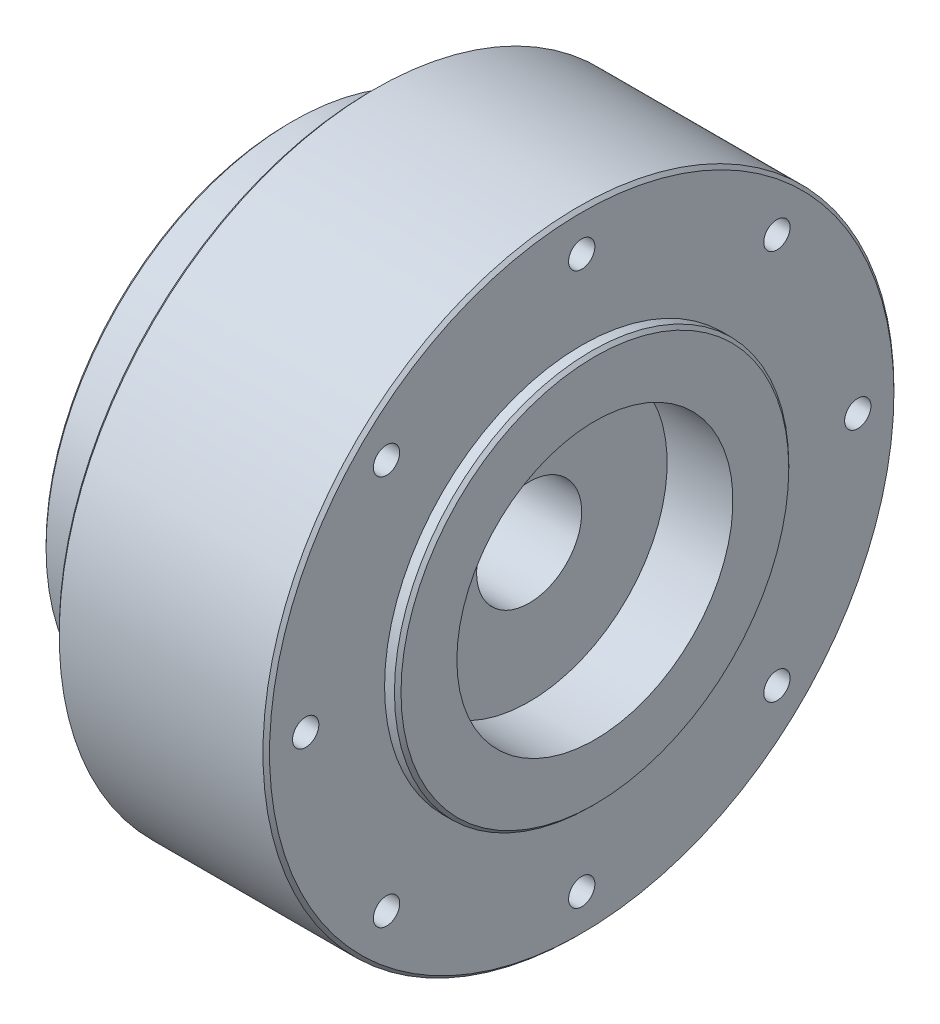
ISO-10303-21;
HEADER;
FILE_DESCRIPTION(('STEP AP214'),'2;1');
FILE_NAME('part.step','',(''),(''),'','','');
FILE_SCHEMA(('AUTOMOTIVE_DESIGN { 1 0 10303 214 1 1 1 1 }'));
ENDSEC;
DATA;
#1=APPLICATION_CONTEXT('core data for automotive mechanical design processes');
#2=APPLICATION_PROTOCOL_DEFINITION('international standard','automotive_design',2000,#1);
#3=PRODUCT_CONTEXT('',#1,'mechanical');
#4=PRODUCT('Part','Part','',(#3));
#5=PRODUCT_RELATED_PRODUCT_CATEGORY('part','',(#4));
#6=PRODUCT_DEFINITION_FORMATION('','',#4);
#7=PRODUCT_DEFINITION_CONTEXT('part definition',#1,'design');
#8=PRODUCT_DEFINITION('design','',#6,#7);
#9=PRODUCT_DEFINITION_SHAPE('','',#8);
#10=(LENGTH_UNIT() NAMED_UNIT(*) SI_UNIT(.MILLI.,.METRE.));
#11=(NAMED_UNIT(*) PLANE_ANGLE_UNIT() SI_UNIT($,.RADIAN.));
#12=(NAMED_UNIT(*) SI_UNIT($,.STERADIAN.) SOLID_ANGLE_UNIT());
#13=UNCERTAINTY_MEASURE_WITH_UNIT(LENGTH_MEASURE(1.E-05),#10,'distance_accuracy_value','');
#14=(GEOMETRIC_REPRESENTATION_CONTEXT(3) GLOBAL_UNCERTAINTY_ASSIGNED_CONTEXT((#13)) GLOBAL_UNIT_ASSIGNED_CONTEXT((#10,
#11,#12)) REPRESENTATION_CONTEXT('',''));
#15=CARTESIAN_POINT('',(0.,0.,0.));
#16=DIRECTION('',(0.,0.,1.));
#17=DIRECTION('',(1.,0.,0.));
#18=AXIS2_PLACEMENT_3D('',#15,#16,#17);
#19=CARTESIAN_POINT('',(-44.5,0.,0.));
#20=DIRECTION('',(-1.,0.,0.));
#21=DIRECTION('',(0.,0.,1.));
#22=AXIS2_PLACEMENT_3D('',#19,#20,#21);
#23=PLANE('',#22);
#24=CARTESIAN_POINT('',(-44.5,0.,0.));
#25=DIRECTION('',(-1.,0.,0.));
#26=DIRECTION('',(0.,0.,1.));
#27=AXIS2_PLACEMENT_3D('',#24,#25,#26);
#28=CIRCLE('',#27,37.);
#29=CARTESIAN_POINT('',(-44.5,0.,37.));
#30=VERTEX_POINT('',#29);
#31=EDGE_CURVE('E88',#30,#30,#28,.T.);
#32=ORIENTED_EDGE('',*,*,#31,.T.);
#33=EDGE_LOOP('',(#32));
#34=FACE_BOUND('',#33,.T.);
#35=ADVANCED_FACE('F47',(#34),#23,.T.);
#36=CARTESIAN_POINT('',(-42.5,0.,0.));
#37=DIRECTION('',(-1.,0.,0.));
#38=DIRECTION('',(0.,0.,1.));
#39=AXIS2_PLACEMENT_3D('',#36,#37,#38);
#40=PLANE('',#39);
#41=CARTESIAN_POINT('',(-42.5,0.,0.));
#42=DIRECTION('',(-1.,0.,0.));
#43=DIRECTION('',(0.,0.,1.));
#44=AXIS2_PLACEMENT_3D('',#41,#42,#43);
#45=CIRCLE('',#44,11.);
#46=CARTESIAN_POINT('',(-42.5,0.,11.));
#47=VERTEX_POINT('',#46);
#48=EDGE_CURVE('E92',#47,#47,#45,.T.);
#49=ORIENTED_EDGE('',*,*,#48,.F.);
#50=EDGE_LOOP('',(#49));
#51=FACE_BOUND('',#50,.T.);
#52=ADVANCED_FACE('F213',(#51),#40,.F.);
#53=CARTESIAN_POINT('',(-32.,0.,0.));
#54=DIRECTION('',(-1.,0.,0.));
#55=DIRECTION('',(0.,0.,1.));
#56=AXIS2_PLACEMENT_3D('',#53,#54,#55);
#57=CYLINDRICAL_SURFACE('',#56,11.);
#58=CARTESIAN_POINT('',(-36.5,0.,0.));
#59=DIRECTION('',(-1.,0.,0.));
#60=DIRECTION('',(0.,0.,1.));
#61=AXIS2_PLACEMENT_3D('',#58,#59,#60);
#62=CIRCLE('',#61,11.);
#63=CARTESIAN_POINT('',(-36.5,0.,11.));
#64=VERTEX_POINT('',#63);
#65=EDGE_CURVE('E96',#64,#64,#62,.T.);
#66=ORIENTED_EDGE('',*,*,#65,.F.);
#67=EDGE_LOOP('',(#66));
#68=FACE_BOUND('',#67,.T.);
#69=ORIENTED_EDGE('',*,*,#48,.T.);
#70=EDGE_LOOP('',(#69));
#71=FACE_BOUND('',#70,.T.);
#72=ADVANCED_FACE('F218',(#68,#71),#57,.F.);
#73=CARTESIAN_POINT('',(-36.5,0.,0.));
#74=DIRECTION('',(1.,0.,0.));
#75=DIRECTION('',(0.,0.,-1.));
#76=AXIS2_PLACEMENT_3D('',#73,#74,#75);
#77=PLANE('',#76);
#78=CARTESIAN_POINT('',(-36.5,0.,0.));
#79=DIRECTION('',(-1.,0.,0.));
#80=DIRECTION('',(0.,0.,1.));
#81=AXIS2_PLACEMENT_3D('',#78,#79,#80);
#82=CIRCLE('',#81,8.);
#83=CARTESIAN_POINT('',(-36.5,0.,8.));
#84=VERTEX_POINT('',#83);
#85=EDGE_CURVE('E100',#84,#84,#82,.T.);
#86=ORIENTED_EDGE('',*,*,#85,.F.);
#87=EDGE_LOOP('',(#86));
#88=FACE_BOUND('',#87,.T.);
#89=ORIENTED_EDGE('',*,*,#65,.T.);
#90=EDGE_LOOP('',(#89));
#91=FACE_BOUND('',#90,.T.);
#92=ADVANCED_FACE('F276',(#88,#91),#77,.F.);
#93=CARTESIAN_POINT('',(-32.,0.,0.));
#94=DIRECTION('',(-1.,0.,0.));
#95=DIRECTION('',(0.,0.,1.));
#96=AXIS2_PLACEMENT_3D('',#93,#94,#95);
#97=CYLINDRICAL_SURFACE('',#96,8.);
#98=CARTESIAN_POINT('',(-8.,0.,0.));
#99=DIRECTION('',(-1.,0.,0.));
#100=DIRECTION('',(0.,0.,1.));
#101=AXIS2_PLACEMENT_3D('',#98,#99,#100);
#102=CIRCLE('',#101,8.);
#103=CARTESIAN_POINT('',(-8.,0.,8.));
#104=VERTEX_POINT('',#103);
#105=EDGE_CURVE('E104',#104,#104,#102,.T.);
#106=ORIENTED_EDGE('',*,*,#105,.F.);
#107=EDGE_LOOP('',(#106));
#108=FACE_BOUND('',#107,.T.);
#109=ORIENTED_EDGE('',*,*,#85,.T.);
#110=EDGE_LOOP('',(#109));
#111=FACE_BOUND('',#110,.T.);
#112=ADVANCED_FACE('F272',(#108,#111),#97,.F.);
#113=CARTESIAN_POINT('',(-8.,0.,0.));
#114=DIRECTION('',(-1.,0.,0.));
#115=DIRECTION('',(0.,0.,1.));
#116=AXIS2_PLACEMENT_3D('',#113,#114,#115);
#117=PLANE('',#116);
#118=CARTESIAN_POINT('',(-8.,0.,0.));
#119=DIRECTION('',(-1.,0.,0.));
#120=DIRECTION('',(0.,0.,1.));
#121=AXIS2_PLACEMENT_3D('',#118,#119,#120);
#122=CIRCLE('',#121,21.);
#123=CARTESIAN_POINT('',(-8.,0.,21.));
#124=VERTEX_POINT('',#123);
#125=EDGE_CURVE('E108',#124,#124,#122,.T.);
#126=ORIENTED_EDGE('',*,*,#125,.F.);
#127=EDGE_LOOP('',(#126));
#128=FACE_BOUND('',#127,.T.);
#129=ORIENTED_EDGE('',*,*,#105,.T.);
#130=EDGE_LOOP('',(#129));
#131=FACE_BOUND('',#130,.T.);
#132=ADVANCED_FACE('F268',(#128,#131),#117,.F.);
#133=CARTESIAN_POINT('',(-32.,0.,0.));
#134=DIRECTION('',(-1.,0.,0.));
#135=DIRECTION('',(0.,0.,1.));
#136=AXIS2_PLACEMENT_3D('',#133,#134,#135);
#137=CYLINDRICAL_SURFACE('',#136,21.);
#138=CARTESIAN_POINT('',(2.,0.,0.));
#139=DIRECTION('',(-1.,0.,0.));
#140=DIRECTION('',(0.,0.,1.));
#141=AXIS2_PLACEMENT_3D('',#138,#139,#140);
#142=CIRCLE('',#141,21.);
#143=CARTESIAN_POINT('',(2.,0.,21.));
#144=VERTEX_POINT('',#143);
#145=EDGE_CURVE('E112',#144,#144,#142,.T.);
#146=ORIENTED_EDGE('',*,*,#145,.F.);
#147=EDGE_LOOP('',(#146));
#148=FACE_BOUND('',#147,.T.);
#149=ORIENTED_EDGE('',*,*,#125,.T.);
#150=EDGE_LOOP('',(#149));
#151=FACE_BOUND('',#150,.T.);
#152=ADVANCED_FACE('F265',(#148,#151),#137,.F.);
#153=CARTESIAN_POINT('',(2.,0.,0.));
#154=DIRECTION('',(1.,0.,0.));
#155=DIRECTION('',(0.,0.,-1.));
#156=AXIS2_PLACEMENT_3D('',#153,#154,#155);
#157=PLANE('',#156);
#158=CARTESIAN_POINT('',(2.,0.,0.));
#159=DIRECTION('',(1.,0.,0.));
#160=DIRECTION('',(0.,0.,-1.));
#161=AXIS2_PLACEMENT_3D('',#158,#159,#160);
#162=CIRCLE('',#161,29.5);
#163=CARTESIAN_POINT('',(2.,0.,-29.5));
#164=VERTEX_POINT('',#163);
#165=EDGE_CURVE('E10',#164,#164,#162,.T.);
#166=ORIENTED_EDGE('',*,*,#165,.T.);
#167=EDGE_LOOP('',(#166));
#168=FACE_BOUND('',#167,.T.);
#169=ORIENTED_EDGE('',*,*,#145,.T.);
#170=EDGE_LOOP('',(#169));
#171=FACE_BOUND('',#170,.T.);
#172=ADVANCED_FACE('F262',(#168,#171),#157,.T.);
#173=CARTESIAN_POINT('',(-32.,0.,0.));
#174=DIRECTION('',(-1.,0.,0.));
#175=DIRECTION('',(0.,0.,1.));
#176=AXIS2_PLACEMENT_3D('',#173,#174,#175);
#177=CYLINDRICAL_SURFACE('',#176,30.);
#178=CARTESIAN_POINT('',(1.50000000000001,0.,0.));
#179=DIRECTION('',(1.,0.,0.));
#180=DIRECTION('',(0.,0.,-1.));
#181=AXIS2_PLACEMENT_3D('',#178,#179,#180);
#182=CIRCLE('',#181,30.);
#183=CARTESIAN_POINT('',(1.50000000000001,0.,-30.));
#184=VERTEX_POINT('',#183);
#185=EDGE_CURVE('E56',#184,#184,#182,.F.);
#186=ORIENTED_EDGE('',*,*,#185,.T.);
#187=EDGE_LOOP('',(#186));
#188=FACE_BOUND('',#187,.T.);
#189=CARTESIAN_POINT('',(0.,0.,0.));
#190=DIRECTION('',(-1.,0.,0.));
#191=DIRECTION('',(0.,0.,1.));
#192=AXIS2_PLACEMENT_3D('',#189,#190,#191);
#193=CIRCLE('',#192,30.);
#194=CARTESIAN_POINT('',(0.,0.,30.));
#195=VERTEX_POINT('',#194);
#196=EDGE_CURVE('E116',#195,#195,#193,.T.);
#197=ORIENTED_EDGE('',*,*,#196,.F.);
#198=EDGE_LOOP('',(#197));
#199=FACE_BOUND('',#198,.T.);
#200=ADVANCED_FACE('F256',(#188,#199),#177,.T.);
#201=CARTESIAN_POINT('',(0.,0.,0.));
#202=DIRECTION('',(1.,0.,0.));
#203=DIRECTION('',(0.,0.,-1.));
#204=AXIS2_PLACEMENT_3D('',#201,#202,#203);
#205=PLANE('',#204);
#206=CARTESIAN_POINT('',(0.,0.,0.));
#207=DIRECTION('',(1.,0.,0.));
#208=DIRECTION('',(0.,0.,-1.));
#209=AXIS2_PLACEMENT_3D('',#206,#207,#208);
#210=CIRCLE('',#209,47.5);
#211=CARTESIAN_POINT('',(0.,0.,-47.5));
#212=VERTEX_POINT('',#211);
#213=EDGE_CURVE('E63',#212,#212,#210,.T.);
#214=ORIENTED_EDGE('',*,*,#213,.T.);
#215=EDGE_LOOP('',(#214));
#216=FACE_BOUND('',#215,.T.);
#217=CARTESIAN_POINT('',(0.,-1.46642216231412E-13,-42.));
#218=DIRECTION('',(1.,0.,0.));
#219=DIRECTION('',(0.,0.,-1.));
#220=AXIS2_PLACEMENT_3D('',#217,#218,#219);
#221=CIRCLE('',#220,2.);
#222=CARTESIAN_POINT('',(0.,-1.46642216231412E-13,-44.));
#223=VERTEX_POINT('',#222);
#224=EDGE_CURVE('E139',#223,#223,#221,.F.);
#225=ORIENTED_EDGE('',*,*,#224,.T.);
#226=EDGE_LOOP('',(#225));
#227=FACE_BOUND('',#226,.T.);
#228=CARTESIAN_POINT('',(0.,-29.6984848098352,-29.6984848098348));
#229=DIRECTION('',(1.,0.,0.));
#230=DIRECTION('',(0.,0.,-1.));
#231=AXIS2_PLACEMENT_3D('',#228,#229,#230);
#232=CIRCLE('',#231,2.);
#233=CARTESIAN_POINT('',(0.,-29.6984848098352,-31.6984848098348));
#234=VERTEX_POINT('',#233);
#235=EDGE_CURVE('E158',#234,#234,#232,.F.);
#236=ORIENTED_EDGE('',*,*,#235,.T.);
#237=EDGE_LOOP('',(#236));
#238=FACE_BOUND('',#237,.T.);
#239=CARTESIAN_POINT('',(0.,-42.,0.));
#240=DIRECTION('',(1.,0.,0.));
#241=DIRECTION('',(0.,0.,-1.));
#242=AXIS2_PLACEMENT_3D('',#239,#240,#241);
#243=CIRCLE('',#242,2.);
#244=CARTESIAN_POINT('',(0.,-42.,-2.));
#245=VERTEX_POINT('',#244);
#246=EDGE_CURVE('E150',#245,#245,#243,.F.);
#247=ORIENTED_EDGE('',*,*,#246,.T.);
#248=EDGE_LOOP('',(#247));
#249=FACE_BOUND('',#248,.T.);
#250=CARTESIAN_POINT('',(0.,-29.6984848098347,29.6984848098353));
#251=DIRECTION('',(1.,0.,0.));
#252=DIRECTION('',(0.,0.,-1.));
#253=AXIS2_PLACEMENT_3D('',#250,#251,#252);
#254=CIRCLE('',#253,2.);
#255=CARTESIAN_POINT('',(0.,-29.6984848098347,27.6984848098353));
#256=VERTEX_POINT('',#255);
#257=EDGE_CURVE('E140',#256,#256,#254,.F.);
#258=ORIENTED_EDGE('',*,*,#257,.T.);
#259=EDGE_LOOP('',(#258));
#260=FACE_BOUND('',#259,.T.);
#261=CARTESIAN_POINT('',(0.,4.39926648694235E-13,42.));
#262=DIRECTION('',(1.,0.,0.));
#263=DIRECTION('',(0.,0.,-1.));
#264=AXIS2_PLACEMENT_3D('',#261,#262,#263);
#265=CIRCLE('',#264,2.);
#266=CARTESIAN_POINT('',(0.,4.39926648694235E-13,40.));
#267=VERTEX_POINT('',#266);
#268=EDGE_CURVE('E149',#267,#267,#265,.F.);
#269=ORIENTED_EDGE('',*,*,#268,.T.);
#270=EDGE_LOOP('',(#269));
#271=FACE_BOUND('',#270,.T.);
#272=CARTESIAN_POINT('',(0.,29.6984848098354,29.6984848098346));
#273=DIRECTION('',(1.,0.,0.));
#274=DIRECTION('',(0.,0.,-1.));
#275=AXIS2_PLACEMENT_3D('',#272,#273,#274);
#276=CIRCLE('',#275,2.);
#277=CARTESIAN_POINT('',(0.,29.6984848098354,27.6984848098346));
#278=VERTEX_POINT('',#277);
#279=EDGE_CURVE('E171',#278,#278,#276,.F.);
#280=ORIENTED_EDGE('',*,*,#279,.T.);
#281=EDGE_LOOP('',(#280));
#282=FACE_BOUND('',#281,.T.);
#283=CARTESIAN_POINT('',(0.,29.6984848098349,-29.6984848098351));
#284=DIRECTION('',(1.,0.,0.));
#285=DIRECTION('',(0.,0.,-1.));
#286=AXIS2_PLACEMENT_3D('',#283,#284,#285);
#287=CIRCLE('',#286,2.);
#288=CARTESIAN_POINT('',(0.,29.6984848098349,-31.6984848098351));
#289=VERTEX_POINT('',#288);
#290=EDGE_CURVE('E132',#289,#289,#287,.F.);
#291=ORIENTED_EDGE('',*,*,#290,.T.);
#292=EDGE_LOOP('',(#291));
#293=FACE_BOUND('',#292,.T.);
#294=CARTESIAN_POINT('',(0.,42.,0.));
#295=DIRECTION('',(1.,0.,0.));
#296=DIRECTION('',(0.,0.,-1.));
#297=AXIS2_PLACEMENT_3D('',#294,#295,#296);
#298=CIRCLE('',#297,2.);
#299=CARTESIAN_POINT('',(0.,42.,-2.));
#300=VERTEX_POINT('',#299);
#301=EDGE_CURVE('E124',#300,#300,#298,.F.);
#302=ORIENTED_EDGE('',*,*,#301,.T.);
#303=EDGE_LOOP('',(#302));
#304=FACE_BOUND('',#303,.T.);
#305=ORIENTED_EDGE('',*,*,#196,.T.);
#306=EDGE_LOOP('',(#305));
#307=FACE_BOUND('',#306,.T.);
#308=ADVANCED_FACE('F251',(#216,#227,#238,#249,#260,#271,#282,#293,#304,#307),#205,.T.);
#309=CARTESIAN_POINT('',(-32.,0.,0.));
#310=DIRECTION('',(-1.,0.,0.));
#311=DIRECTION('',(0.,0.,1.));
#312=AXIS2_PLACEMENT_3D('',#309,#310,#311);
#313=CYLINDRICAL_SURFACE('',#312,48.);
#314=CARTESIAN_POINT('',(-31.5,0.,0.));
#315=DIRECTION('',(1.,0.,0.));
#316=DIRECTION('',(0.,0.,-1.));
#317=AXIS2_PLACEMENT_3D('',#314,#315,#316);
#318=CIRCLE('',#317,48.);
#319=CARTESIAN_POINT('',(-31.5,0.,-48.));
#320=VERTEX_POINT('',#319);
#321=EDGE_CURVE('E70',#320,#320,#318,.T.);
#322=ORIENTED_EDGE('',*,*,#321,.T.);
#323=EDGE_LOOP('',(#322));
#324=FACE_BOUND('',#323,.T.);
#325=CARTESIAN_POINT('',(-0.500000000000014,0.,0.));
#326=DIRECTION('',(1.,0.,0.));
#327=DIRECTION('',(0.,0.,-1.));
#328=AXIS2_PLACEMENT_3D('',#325,#326,#327);
#329=CIRCLE('',#328,48.);
#330=CARTESIAN_POINT('',(-0.500000000000014,0.,-48.));
#331=VERTEX_POINT('',#330);
#332=EDGE_CURVE('E76',#331,#331,#329,.F.);
#333=ORIENTED_EDGE('',*,*,#332,.T.);
#334=EDGE_LOOP('',(#333));
#335=FACE_BOUND('',#334,.T.);
#336=ADVANCED_FACE('F192',(#324,#335),#313,.T.);
#337=CARTESIAN_POINT('',(-32.,0.,0.));
#338=DIRECTION('',(1.,0.,0.));
#339=DIRECTION('',(0.,0.,-1.));
#340=AXIS2_PLACEMENT_3D('',#337,#338,#339);
#341=PLANE('',#340);
#342=CARTESIAN_POINT('',(-32.,0.,0.));
#343=DIRECTION('',(1.,0.,0.));
#344=DIRECTION('',(0.,0.,-1.));
#345=AXIS2_PLACEMENT_3D('',#342,#343,#344);
#346=CIRCLE('',#345,47.5);
#347=CARTESIAN_POINT('',(-32.,0.,-47.5));
#348=VERTEX_POINT('',#347);
#349=EDGE_CURVE('E80',#348,#348,#346,.F.);
#350=ORIENTED_EDGE('',*,*,#349,.T.);
#351=EDGE_LOOP('',(#350));
#352=FACE_BOUND('',#351,.T.);
#353=CARTESIAN_POINT('',(-32.,-1.46642216231412E-13,-42.));
#354=DIRECTION('',(-1.,0.,0.));
#355=DIRECTION('',(0.,1.,0.));
#356=AXIS2_PLACEMENT_3D('',#353,#354,#355);
#357=CIRCLE('',#356,2.);
#358=CARTESIAN_POINT('',(-32.,1.99999999999985,-42.));
#359=VERTEX_POINT('',#358);
#360=EDGE_CURVE('E161',#359,#359,#357,.T.);
#361=ORIENTED_EDGE('',*,*,#360,.F.);
#362=EDGE_LOOP('',(#361));
#363=FACE_BOUND('',#362,.T.);
#364=CARTESIAN_POINT('',(-32.,-29.6984848098352,-29.6984848098348));
#365=DIRECTION('',(-1.,0.,0.));
#366=DIRECTION('',(0.,0.707106781186544,-0.707106781186551));
#367=AXIS2_PLACEMENT_3D('',#364,#365,#366);
#368=CIRCLE('',#367,2.);
#369=CARTESIAN_POINT('',(-32.,-28.2842712474621,-31.1126983722079));
#370=VERTEX_POINT('',#369);
#371=EDGE_CURVE('E154',#370,#370,#368,.T.);
#372=ORIENTED_EDGE('',*,*,#371,.F.);
#373=EDGE_LOOP('',(#372));
#374=FACE_BOUND('',#373,.T.);
#375=CARTESIAN_POINT('',(-32.,-42.,0.));
#376=DIRECTION('',(-1.,0.,0.));
#377=DIRECTION('',(0.,0.,-1.));
#378=AXIS2_PLACEMENT_3D('',#375,#376,#377);
#379=CIRCLE('',#378,2.);
#380=CARTESIAN_POINT('',(-32.,-42.,-2.));
#381=VERTEX_POINT('',#380);
#382=EDGE_CURVE('E144',#381,#381,#379,.T.);
#383=ORIENTED_EDGE('',*,*,#382,.F.);
#384=EDGE_LOOP('',(#383));
#385=FACE_BOUND('',#384,.T.);
#386=CARTESIAN_POINT('',(-32.,-29.6984848098347,29.6984848098353));
#387=DIRECTION('',(-1.,0.,0.));
#388=DIRECTION('',(0.,-0.707106781186554,-0.707106781186541));
#389=AXIS2_PLACEMENT_3D('',#386,#387,#388);
#390=CIRCLE('',#389,2.);
#391=CARTESIAN_POINT('',(-32.,-31.1126983722078,28.2842712474622));
#392=VERTEX_POINT('',#391);
#393=EDGE_CURVE('E145',#392,#392,#390,.T.);
#394=ORIENTED_EDGE('',*,*,#393,.F.);
#395=EDGE_LOOP('',(#394));
#396=FACE_BOUND('',#395,.T.);
#397=CARTESIAN_POINT('',(-32.,4.39926648694235E-13,42.));
#398=DIRECTION('',(-1.,0.,0.));
#399=DIRECTION('',(0.,-1.,0.));
#400=AXIS2_PLACEMENT_3D('',#397,#398,#399);
#401=CIRCLE('',#400,2.);
#402=CARTESIAN_POINT('',(-32.,-1.99999999999956,42.));
#403=VERTEX_POINT('',#402);
#404=EDGE_CURVE('E174',#403,#403,#401,.T.);
#405=ORIENTED_EDGE('',*,*,#404,.F.);
#406=EDGE_LOOP('',(#405));
#407=FACE_BOUND('',#406,.T.);
#408=CARTESIAN_POINT('',(-32.,29.6984848098354,29.6984848098346));
#409=DIRECTION('',(-1.,0.,0.));
#410=DIRECTION('',(0.,-0.707106781186539,0.707106781186556));
#411=AXIS2_PLACEMENT_3D('',#408,#409,#410);
#412=CIRCLE('',#411,2.);
#413=CARTESIAN_POINT('',(-32.,28.2842712474623,31.1126983722078));
#414=VERTEX_POINT('',#413);
#415=EDGE_CURVE('E175',#414,#414,#412,.T.);
#416=ORIENTED_EDGE('',*,*,#415,.F.);
#417=EDGE_LOOP('',(#416));
#418=FACE_BOUND('',#417,.T.);
#419=CARTESIAN_POINT('',(-32.,29.6984848098349,-29.6984848098351));
#420=DIRECTION('',(-1.,0.,0.));
#421=DIRECTION('',(0.,0.707106781186549,0.707106781186546));
#422=AXIS2_PLACEMENT_3D('',#419,#420,#421);
#423=CIRCLE('',#422,2.);
#424=CARTESIAN_POINT('',(-32.,31.112698372208,-28.284271247462));
#425=VERTEX_POINT('',#424);
#426=EDGE_CURVE('E136',#425,#425,#423,.T.);
#427=ORIENTED_EDGE('',*,*,#426,.F.);
#428=EDGE_LOOP('',(#427));
#429=FACE_BOUND('',#428,.T.);
#430=CARTESIAN_POINT('',(-32.,42.,0.));
#431=DIRECTION('',(-1.,0.,0.));
#432=DIRECTION('',(0.,0.,1.));
#433=AXIS2_PLACEMENT_3D('',#430,#431,#432);
#434=CIRCLE('',#433,2.);
#435=CARTESIAN_POINT('',(-32.,42.,2.));
#436=VERTEX_POINT('',#435);
#437=EDGE_CURVE('E128',#436,#436,#434,.T.);
#438=ORIENTED_EDGE('',*,*,#437,.F.);
#439=EDGE_LOOP('',(#438));
#440=FACE_BOUND('',#439,.T.);
#441=CARTESIAN_POINT('',(-32.,0.,0.));
#442=DIRECTION('',(-1.,0.,0.));
#443=DIRECTION('',(0.,0.,1.));
#444=AXIS2_PLACEMENT_3D('',#441,#442,#443);
#445=CIRCLE('',#444,37.5);
#446=CARTESIAN_POINT('',(-32.,0.,37.5));
#447=VERTEX_POINT('',#446);
#448=EDGE_CURVE('E120',#447,#447,#445,.T.);
#449=ORIENTED_EDGE('',*,*,#448,.F.);
#450=EDGE_LOOP('',(#449));
#451=FACE_BOUND('',#450,.T.);
#452=ADVANCED_FACE('F188',(#352,#363,#374,#385,#396,#407,#418,#429,#440,#451),#341,.F.);
#453=CARTESIAN_POINT('',(-32.,0.,0.));
#454=DIRECTION('',(-1.,0.,0.));
#455=DIRECTION('',(0.,0.,1.));
#456=AXIS2_PLACEMENT_3D('',#453,#454,#455);
#457=CYLINDRICAL_SURFACE('',#456,37.5);
#458=CARTESIAN_POINT('',(-44.,0.,0.));
#459=DIRECTION('',(-1.,0.,0.));
#460=DIRECTION('',(0.,0.,1.));
#461=AXIS2_PLACEMENT_3D('',#458,#459,#460);
#462=CIRCLE('',#461,37.5);
#463=CARTESIAN_POINT('',(-44.,0.,37.5));
#464=VERTEX_POINT('',#463);
#465=EDGE_CURVE('E84',#464,#464,#462,.F.);
#466=ORIENTED_EDGE('',*,*,#465,.T.);
#467=EDGE_LOOP('',(#466));
#468=FACE_BOUND('',#467,.T.);
#469=ORIENTED_EDGE('',*,*,#448,.T.);
#470=EDGE_LOOP('',(#469));
#471=FACE_BOUND('',#470,.T.);
#472=ADVANCED_FACE('F191',(#468,#471),#457,.T.);
#473=CARTESIAN_POINT('',(5.65685424949239,42.,0.));
#474=DIRECTION('',(-1.,0.,0.));
#475=DIRECTION('',(0.,0.,1.));
#476=AXIS2_PLACEMENT_3D('',#473,#474,#475);
#477=CYLINDRICAL_SURFACE('',#476,2.);
#478=ORIENTED_EDGE('',*,*,#437,.T.);
#479=EDGE_LOOP('',(#478));
#480=FACE_BOUND('',#479,.T.);
#481=ORIENTED_EDGE('',*,*,#301,.F.);
#482=EDGE_LOOP('',(#481));
#483=FACE_BOUND('',#482,.T.);
#484=ADVANCED_FACE('F204',(#480,#483),#477,.F.);
#485=CARTESIAN_POINT('',(5.65685424949239,29.6984848098349,-29.6984848098351));
#486=DIRECTION('',(-1.,0.,0.));
#487=DIRECTION('',(0.,0.,1.));
#488=AXIS2_PLACEMENT_3D('',#485,#486,#487);
#489=CYLINDRICAL_SURFACE('',#488,2.);
#490=ORIENTED_EDGE('',*,*,#426,.T.);
#491=EDGE_LOOP('',(#490));
#492=FACE_BOUND('',#491,.T.);
#493=ORIENTED_EDGE('',*,*,#290,.F.);
#494=EDGE_LOOP('',(#493));
#495=FACE_BOUND('',#494,.T.);
#496=ADVANCED_FACE('F209',(#492,#495),#489,.F.);
#497=CARTESIAN_POINT('',(5.65685424949237,29.6984848098354,29.6984848098346));
#498=DIRECTION('',(-1.,0.,0.));
#499=DIRECTION('',(0.,0.,1.));
#500=AXIS2_PLACEMENT_3D('',#497,#498,#499);
#501=CYLINDRICAL_SURFACE('',#500,2.);
#502=ORIENTED_EDGE('',*,*,#415,.T.);
#503=EDGE_LOOP('',(#502));
#504=FACE_BOUND('',#503,.T.);
#505=ORIENTED_EDGE('',*,*,#279,.F.);
#506=EDGE_LOOP('',(#505));
#507=FACE_BOUND('',#506,.T.);
#508=ADVANCED_FACE('F405',(#504,#507),#501,.F.);
#509=CARTESIAN_POINT('',(5.65685424949239,4.39926648694235E-13,42.));
#510=DIRECTION('',(-1.,0.,0.));
#511=DIRECTION('',(0.,0.,1.));
#512=AXIS2_PLACEMENT_3D('',#509,#510,#511);
#513=CYLINDRICAL_SURFACE('',#512,2.);
#514=ORIENTED_EDGE('',*,*,#404,.T.);
#515=EDGE_LOOP('',(#514));
#516=FACE_BOUND('',#515,.T.);
#517=ORIENTED_EDGE('',*,*,#268,.F.);
#518=EDGE_LOOP('',(#517));
#519=FACE_BOUND('',#518,.T.);
#520=ADVANCED_FACE('F185',(#516,#519),#513,.F.);
#521=CARTESIAN_POINT('',(5.65685424949239,-29.6984848098347,29.6984848098353));
#522=DIRECTION('',(-1.,0.,0.));
#523=DIRECTION('',(0.,0.,1.));
#524=AXIS2_PLACEMENT_3D('',#521,#522,#523);
#525=CYLINDRICAL_SURFACE('',#524,2.);
#526=ORIENTED_EDGE('',*,*,#393,.T.);
#527=EDGE_LOOP('',(#526));
#528=FACE_BOUND('',#527,.T.);
#529=ORIENTED_EDGE('',*,*,#257,.F.);
#530=EDGE_LOOP('',(#529));
#531=FACE_BOUND('',#530,.T.);
#532=ADVANCED_FACE('F386',(#528,#531),#525,.F.);
#533=CARTESIAN_POINT('',(5.65685424949239,-42.,0.));
#534=DIRECTION('',(-1.,0.,0.));
#535=DIRECTION('',(0.,0.,1.));
#536=AXIS2_PLACEMENT_3D('',#533,#534,#535);
#537=CYLINDRICAL_SURFACE('',#536,2.);
#538=ORIENTED_EDGE('',*,*,#382,.T.);
#539=EDGE_LOOP('',(#538));
#540=FACE_BOUND('',#539,.T.);
#541=ORIENTED_EDGE('',*,*,#246,.F.);
#542=EDGE_LOOP('',(#541));
#543=FACE_BOUND('',#542,.T.);
#544=ADVANCED_FACE('F376',(#540,#543),#537,.F.);
#545=CARTESIAN_POINT('',(5.65685424949239,-29.6984848098352,-29.6984848098348));
#546=DIRECTION('',(-1.,0.,0.));
#547=DIRECTION('',(0.,0.,1.));
#548=AXIS2_PLACEMENT_3D('',#545,#546,#547);
#549=CYLINDRICAL_SURFACE('',#548,2.);
#550=ORIENTED_EDGE('',*,*,#371,.T.);
#551=EDGE_LOOP('',(#550));
#552=FACE_BOUND('',#551,.T.);
#553=ORIENTED_EDGE('',*,*,#235,.F.);
#554=EDGE_LOOP('',(#553));
#555=FACE_BOUND('',#554,.T.);
#556=ADVANCED_FACE('F367',(#552,#555),#549,.F.);
#557=CARTESIAN_POINT('',(5.65685424949239,-1.46642216231412E-13,-42.));
#558=DIRECTION('',(-1.,0.,0.));
#559=DIRECTION('',(0.,0.,1.));
#560=AXIS2_PLACEMENT_3D('',#557,#558,#559);
#561=CYLINDRICAL_SURFACE('',#560,2.);
#562=ORIENTED_EDGE('',*,*,#360,.T.);
#563=EDGE_LOOP('',(#562));
#564=FACE_BOUND('',#563,.T.);
#565=ORIENTED_EDGE('',*,*,#224,.F.);
#566=EDGE_LOOP('',(#565));
#567=FACE_BOUND('',#566,.T.);
#568=ADVANCED_FACE('F231',(#564,#567),#561,.F.);
#569=CARTESIAN_POINT('',(-44.5,0.,0.));
#570=DIRECTION('',(1.,0.,0.));
#571=DIRECTION('',(0.,0.,-1.));
#572=AXIS2_PLACEMENT_3D('',#569,#570,#571);
#573=CONICAL_SURFACE('',#572,37.,0.785398163397455);
#574=ORIENTED_EDGE('',*,*,#465,.F.);
#575=EDGE_LOOP('',(#574));
#576=FACE_BOUND('',#575,.T.);
#577=ORIENTED_EDGE('',*,*,#31,.F.);
#578=EDGE_LOOP('',(#577));
#579=FACE_BOUND('',#578,.T.);
#580=ADVANCED_FACE('F224',(#576,#579),#573,.T.);
#581=CARTESIAN_POINT('',(-32.,0.,0.));
#582=DIRECTION('',(1.,0.,0.));
#583=DIRECTION('',(0.,0.,-1.));
#584=AXIS2_PLACEMENT_3D('',#581,#582,#583);
#585=CONICAL_SURFACE('',#584,47.5,0.785398163397428);
#586=ORIENTED_EDGE('',*,*,#321,.F.);
#587=EDGE_LOOP('',(#586));
#588=FACE_BOUND('',#587,.T.);
#589=ORIENTED_EDGE('',*,*,#349,.F.);
#590=EDGE_LOOP('',(#589));
#591=FACE_BOUND('',#590,.T.);
#592=ADVANCED_FACE('F230',(#588,#591),#585,.T.);
#593=CARTESIAN_POINT('',(-0.500000000000014,0.,0.));
#594=DIRECTION('',(-1.,0.,0.));
#595=DIRECTION('',(0.,0.,1.));
#596=AXIS2_PLACEMENT_3D('',#593,#594,#595);
#597=CONICAL_SURFACE('',#596,48.,0.785398163397448);
#598=ORIENTED_EDGE('',*,*,#213,.F.);
#599=EDGE_LOOP('',(#598));
#600=FACE_BOUND('',#599,.T.);
#601=ORIENTED_EDGE('',*,*,#332,.F.);
#602=EDGE_LOOP('',(#601));
#603=FACE_BOUND('',#602,.T.);
#604=ADVANCED_FACE('F237',(#600,#603),#597,.T.);
#605=CARTESIAN_POINT('',(1.50000000000001,0.,0.));
#606=DIRECTION('',(-1.,0.,0.));
#607=DIRECTION('',(0.,0.,1.));
#608=AXIS2_PLACEMENT_3D('',#605,#606,#607);
#609=CONICAL_SURFACE('',#608,30.,0.785398163397452);
#610=ORIENTED_EDGE('',*,*,#165,.F.);
#611=EDGE_LOOP('',(#610));
#612=FACE_BOUND('',#611,.T.);
#613=ORIENTED_EDGE('',*,*,#185,.F.);
#614=EDGE_LOOP('',(#613));
#615=FACE_BOUND('',#614,.T.);
#616=ADVANCED_FACE('F50',(#612,#615),#609,.T.);
#617=CLOSED_SHELL('',(#35,#52,#72,#92,#112,#132,#152,#172,#200,#308,#336,#452,#472,#484,#496,
#508,#520,#532,#544,#556,#568,#580,#592,#604,#616));
#618=MANIFOLD_SOLID_BREP('B2',#617);
#619=ADVANCED_BREP_SHAPE_REPRESENTATION('',(#18,#618),#14);
#620=SHAPE_DEFINITION_REPRESENTATION(#9,#619);
ENDSEC;
END-ISO-10303-21;
